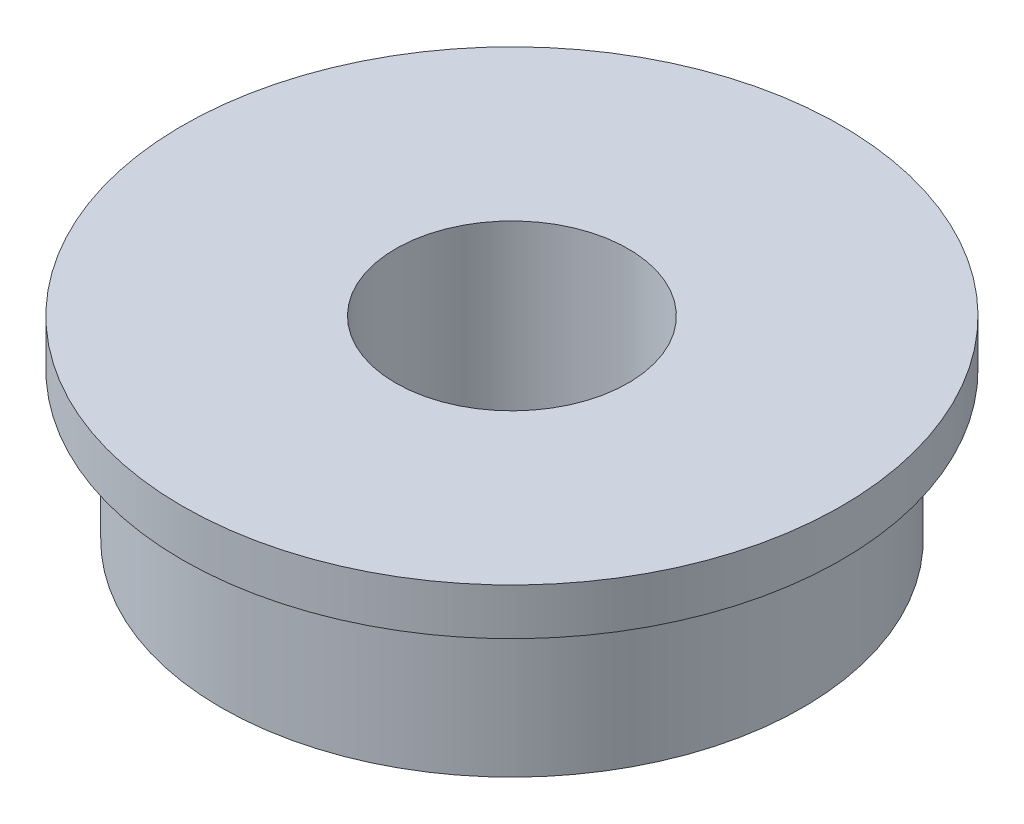
ISO-10303-21;
HEADER;
FILE_DESCRIPTION(('STEP AP214'),'2;1');
FILE_NAME('part.step','',(''),(''),'','','');
FILE_SCHEMA(('AUTOMOTIVE_DESIGN { 1 0 10303 214 1 1 1 1 }'));
ENDSEC;
DATA;
#1=APPLICATION_CONTEXT('core data for automotive mechanical design processes');
#2=APPLICATION_PROTOCOL_DEFINITION('international standard','automotive_design',2000,#1);
#3=PRODUCT_CONTEXT('',#1,'mechanical');
#4=PRODUCT('Part','Part','',(#3));
#5=PRODUCT_RELATED_PRODUCT_CATEGORY('part','',(#4));
#6=PRODUCT_DEFINITION_FORMATION('','',#4);
#7=PRODUCT_DEFINITION_CONTEXT('part definition',#1,'design');
#8=PRODUCT_DEFINITION('design','',#6,#7);
#9=PRODUCT_DEFINITION_SHAPE('','',#8);
#10=(LENGTH_UNIT() NAMED_UNIT(*) SI_UNIT(.MILLI.,.METRE.));
#11=(NAMED_UNIT(*) PLANE_ANGLE_UNIT() SI_UNIT($,.RADIAN.));
#12=(NAMED_UNIT(*) SI_UNIT($,.STERADIAN.) SOLID_ANGLE_UNIT());
#13=UNCERTAINTY_MEASURE_WITH_UNIT(LENGTH_MEASURE(1.E-05),#10,'distance_accuracy_value','');
#14=(GEOMETRIC_REPRESENTATION_CONTEXT(3) GLOBAL_UNCERTAINTY_ASSIGNED_CONTEXT((#13)) GLOBAL_UNIT_ASSIGNED_CONTEXT((#10,
#11,#12)) REPRESENTATION_CONTEXT('',''));
#15=CARTESIAN_POINT('',(0.,0.,0.));
#16=DIRECTION('',(0.,0.,1.));
#17=DIRECTION('',(1.,0.,0.));
#18=AXIS2_PLACEMENT_3D('',#15,#16,#17);
#19=CARTESIAN_POINT('',(0.,3.81188480842175,0.));
#20=DIRECTION('',(0.,1.,0.));
#21=DIRECTION('',(0.,0.,1.));
#22=AXIS2_PLACEMENT_3D('',#19,#20,#21);
#23=CYLINDRICAL_SURFACE('',#22,7.5);
#24=CARTESIAN_POINT('',(0.,3.8,0.));
#25=DIRECTION('',(0.,1.,0.));
#26=DIRECTION('',(0.,0.,1.));
#27=AXIS2_PLACEMENT_3D('',#24,#25,#26);
#28=CIRCLE('',#27,7.5);
#29=CARTESIAN_POINT('',(0.,3.8,7.5));
#30=VERTEX_POINT('',#29);
#31=EDGE_CURVE('E61',#30,#30,#28,.T.);
#32=ORIENTED_EDGE('',*,*,#31,.F.);
#33=EDGE_LOOP('',(#32));
#34=FACE_BOUND('',#33,.T.);
#35=CARTESIAN_POINT('',(0.,0.,0.));
#36=DIRECTION('',(0.,1.,0.));
#37=DIRECTION('',(0.,0.,1.));
#38=AXIS2_PLACEMENT_3D('',#35,#36,#37);
#39=CIRCLE('',#38,7.5);
#40=CARTESIAN_POINT('',(0.,0.,7.5));
#41=VERTEX_POINT('',#40);
#42=EDGE_CURVE('E10',#41,#41,#39,.T.);
#43=ORIENTED_EDGE('',*,*,#42,.T.);
#44=EDGE_LOOP('',(#43));
#45=FACE_BOUND('',#44,.T.);
#46=ADVANCED_FACE('F39',(#34,#45),#23,.T.);
#47=CARTESIAN_POINT('',(3.,0.,0.));
#48=DIRECTION('',(0.,1.,0.));
#49=DIRECTION('',(0.,0.,1.));
#50=AXIS2_PLACEMENT_3D('',#47,#48,#49);
#51=PLANE('',#50);
#52=ORIENTED_EDGE('',*,*,#42,.F.);
#53=EDGE_LOOP('',(#52));
#54=FACE_BOUND('',#53,.T.);
#55=CARTESIAN_POINT('',(0.,0.,0.));
#56=DIRECTION('',(0.,1.,0.));
#57=DIRECTION('',(0.,0.,1.));
#58=AXIS2_PLACEMENT_3D('',#55,#56,#57);
#59=CIRCLE('',#58,3.);
#60=CARTESIAN_POINT('',(0.,0.,3.));
#61=VERTEX_POINT('',#60);
#62=EDGE_CURVE('E45',#61,#61,#59,.T.);
#63=ORIENTED_EDGE('',*,*,#62,.T.);
#64=EDGE_LOOP('',(#63));
#65=FACE_BOUND('',#64,.T.);
#66=ADVANCED_FACE('F68',(#54,#65),#51,.F.);
#67=CARTESIAN_POINT('',(0.,3.81188480842175,0.));
#68=DIRECTION('',(0.,1.,0.));
#69=DIRECTION('',(0.,0.,1.));
#70=AXIS2_PLACEMENT_3D('',#67,#68,#69);
#71=CYLINDRICAL_SURFACE('',#70,3.);
#72=ORIENTED_EDGE('',*,*,#62,.F.);
#73=EDGE_LOOP('',(#72));
#74=FACE_BOUND('',#73,.T.);
#75=CARTESIAN_POINT('',(0.,5.,0.));
#76=DIRECTION('',(0.,1.,0.));
#77=DIRECTION('',(0.,0.,1.));
#78=AXIS2_PLACEMENT_3D('',#75,#76,#77);
#79=CIRCLE('',#78,3.);
#80=CARTESIAN_POINT('',(0.,5.,3.));
#81=VERTEX_POINT('',#80);
#82=EDGE_CURVE('E49',#81,#81,#79,.T.);
#83=ORIENTED_EDGE('',*,*,#82,.T.);
#84=EDGE_LOOP('',(#83));
#85=FACE_BOUND('',#84,.T.);
#86=ADVANCED_FACE('F72',(#74,#85),#71,.F.);
#87=CARTESIAN_POINT('',(8.5,5.,0.));
#88=DIRECTION('',(0.,-1.,0.));
#89=DIRECTION('',(0.,0.,-1.));
#90=AXIS2_PLACEMENT_3D('',#87,#88,#89);
#91=PLANE('',#90);
#92=ORIENTED_EDGE('',*,*,#82,.F.);
#93=EDGE_LOOP('',(#92));
#94=FACE_BOUND('',#93,.T.);
#95=CARTESIAN_POINT('',(0.,5.,0.));
#96=DIRECTION('',(0.,1.,0.));
#97=DIRECTION('',(0.,0.,1.));
#98=AXIS2_PLACEMENT_3D('',#95,#96,#97);
#99=CIRCLE('',#98,8.5);
#100=CARTESIAN_POINT('',(0.,5.,8.5));
#101=VERTEX_POINT('',#100);
#102=EDGE_CURVE('E53',#101,#101,#99,.T.);
#103=ORIENTED_EDGE('',*,*,#102,.T.);
#104=EDGE_LOOP('',(#103));
#105=FACE_BOUND('',#104,.T.);
#106=ADVANCED_FACE('F77',(#94,#105),#91,.F.);
#107=CARTESIAN_POINT('',(0.,3.81188480842175,0.));
#108=DIRECTION('',(0.,1.,0.));
#109=DIRECTION('',(0.,0.,1.));
#110=AXIS2_PLACEMENT_3D('',#107,#108,#109);
#111=CYLINDRICAL_SURFACE('',#110,8.5);
#112=ORIENTED_EDGE('',*,*,#102,.F.);
#113=EDGE_LOOP('',(#112));
#114=FACE_BOUND('',#113,.T.);
#115=CARTESIAN_POINT('',(0.,3.8,0.));
#116=DIRECTION('',(0.,1.,0.));
#117=DIRECTION('',(0.,0.,1.));
#118=AXIS2_PLACEMENT_3D('',#115,#116,#117);
#119=CIRCLE('',#118,8.5);
#120=CARTESIAN_POINT('',(0.,3.8,8.5));
#121=VERTEX_POINT('',#120);
#122=EDGE_CURVE('E58',#121,#121,#119,.T.);
#123=ORIENTED_EDGE('',*,*,#122,.T.);
#124=EDGE_LOOP('',(#123));
#125=FACE_BOUND('',#124,.T.);
#126=ADVANCED_FACE('F83',(#114,#125),#111,.T.);
#127=CARTESIAN_POINT('',(7.5,3.8,0.));
#128=DIRECTION('',(0.,1.,0.));
#129=DIRECTION('',(0.,0.,1.));
#130=AXIS2_PLACEMENT_3D('',#127,#128,#129);
#131=PLANE('',#130);
#132=ORIENTED_EDGE('',*,*,#122,.F.);
#133=EDGE_LOOP('',(#132));
#134=FACE_BOUND('',#133,.T.);
#135=ORIENTED_EDGE('',*,*,#31,.T.);
#136=EDGE_LOOP('',(#135));
#137=FACE_BOUND('',#136,.T.);
#138=ADVANCED_FACE('F65',(#134,#137),#131,.F.);
#139=CLOSED_SHELL('',(#46,#66,#86,#106,#126,#138));
#140=MANIFOLD_SOLID_BREP('B2',#139);
#141=ADVANCED_BREP_SHAPE_REPRESENTATION('',(#18,#140),#14);
#142=SHAPE_DEFINITION_REPRESENTATION(#9,#141);
ENDSEC;
END-ISO-10303-21;
